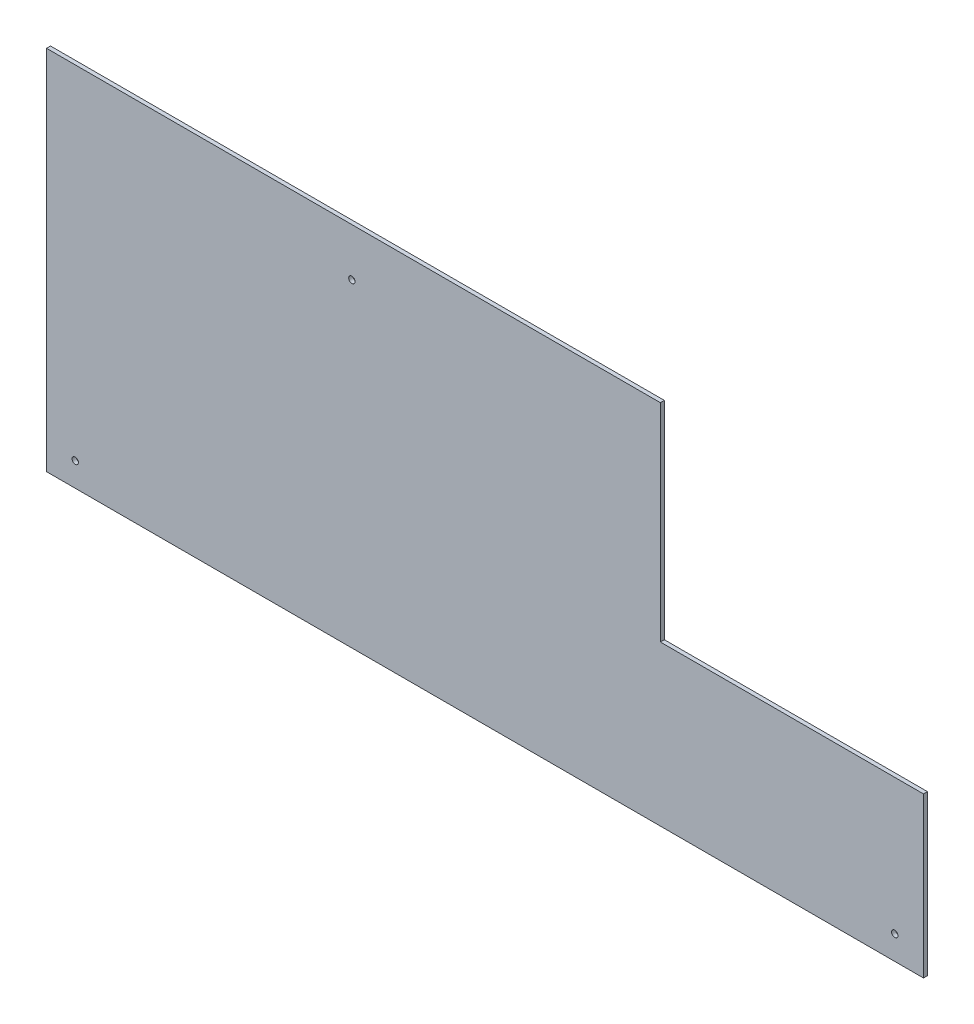
ISO-10303-21;
HEADER;
FILE_DESCRIPTION(('STEP AP214'),'2;1');
FILE_NAME('part.step','',(''),(''),'','','');
FILE_SCHEMA(('AUTOMOTIVE_DESIGN { 1 0 10303 214 1 1 1 1 }'));
ENDSEC;
DATA;
#1=APPLICATION_CONTEXT('core data for automotive mechanical design processes');
#2=APPLICATION_PROTOCOL_DEFINITION('international standard','automotive_design',2000,#1);
#3=PRODUCT_CONTEXT('',#1,'mechanical');
#4=PRODUCT('Part','Part','',(#3));
#5=PRODUCT_RELATED_PRODUCT_CATEGORY('part','',(#4));
#6=PRODUCT_DEFINITION_FORMATION('','',#4);
#7=PRODUCT_DEFINITION_CONTEXT('part definition',#1,'design');
#8=PRODUCT_DEFINITION('design','',#6,#7);
#9=PRODUCT_DEFINITION_SHAPE('','',#8);
#10=(LENGTH_UNIT() NAMED_UNIT(*) SI_UNIT(.MILLI.,.METRE.));
#11=(NAMED_UNIT(*) PLANE_ANGLE_UNIT() SI_UNIT($,.RADIAN.));
#12=(NAMED_UNIT(*) SI_UNIT($,.STERADIAN.) SOLID_ANGLE_UNIT());
#13=UNCERTAINTY_MEASURE_WITH_UNIT(LENGTH_MEASURE(1.E-05),#10,'distance_accuracy_value','');
#14=(GEOMETRIC_REPRESENTATION_CONTEXT(3) GLOBAL_UNCERTAINTY_ASSIGNED_CONTEXT((#13)) GLOBAL_UNIT_ASSIGNED_CONTEXT((#10,
#11,#12)) REPRESENTATION_CONTEXT('',''));
#15=CARTESIAN_POINT('',(0.,0.,0.));
#16=DIRECTION('',(0.,0.,1.));
#17=DIRECTION('',(1.,0.,0.));
#18=AXIS2_PLACEMENT_3D('',#15,#16,#17);
#19=CARTESIAN_POINT('',(275.,-115.,2.5));
#20=DIRECTION('',(-1.,0.,0.));
#21=DIRECTION('',(0.,0.,1.));
#22=AXIS2_PLACEMENT_3D('',#19,#20,#21);
#23=PLANE('',#22);
#24=DIRECTION('',(0.,1.,0.));
#25=VECTOR('',#24,1.);
#26=CARTESIAN_POINT('',(275.,-115.,0.));
#27=LINE('',#26,#25);
#28=CARTESIAN_POINT('',(275.,-115.,0.));
#29=VERTEX_POINT('',#28);
#30=CARTESIAN_POINT('',(275.,-15.,0.));
#31=VERTEX_POINT('',#30);
#32=EDGE_CURVE('E132',#29,#31,#27,.T.);
#33=ORIENTED_EDGE('',*,*,#32,.T.);
#34=DIRECTION('',(0.,0.,-1.));
#35=VECTOR('',#34,1.);
#36=CARTESIAN_POINT('',(275.,-15.,10.));
#37=LINE('',#36,#35);
#38=CARTESIAN_POINT('',(275.,-15.,2.5));
#39=VERTEX_POINT('',#38);
#40=EDGE_CURVE('E57',#39,#31,#37,.T.);
#41=ORIENTED_EDGE('',*,*,#40,.F.);
#42=DIRECTION('',(0.,1.,0.));
#43=VECTOR('',#42,1.);
#44=CARTESIAN_POINT('',(275.,-115.,2.5));
#45=LINE('',#44,#43);
#46=CARTESIAN_POINT('',(275.,-115.,2.5));
#47=VERTEX_POINT('',#46);
#48=EDGE_CURVE('E133',#47,#39,#45,.T.);
#49=ORIENTED_EDGE('',*,*,#48,.F.);
#50=DIRECTION('',(0.,0.,-1.));
#51=VECTOR('',#50,1.);
#52=CARTESIAN_POINT('',(275.,-115.,2.5));
#53=LINE('',#52,#51);
#54=EDGE_CURVE('E139',#47,#29,#53,.T.);
#55=ORIENTED_EDGE('',*,*,#54,.T.);
#56=EDGE_LOOP('',(#33,#41,#49,#55));
#57=FACE_BOUND('',#56,.T.);
#58=ADVANCED_FACE('F41',(#57),#23,.F.);
#59=CARTESIAN_POINT('',(275.,115.,2.5));
#60=DIRECTION('',(0.,-1.,0.));
#61=DIRECTION('',(1.,0.,0.));
#62=AXIS2_PLACEMENT_3D('',#59,#60,#61);
#63=PLANE('',#62);
#64=DIRECTION('',(-1.,0.,0.));
#65=VECTOR('',#64,1.);
#66=CARTESIAN_POINT('',(275.,115.,2.5));
#67=LINE('',#66,#65);
#68=CARTESIAN_POINT('',(110.,115.,2.5));
#69=VERTEX_POINT('',#68);
#70=CARTESIAN_POINT('',(-275.,115.,2.5));
#71=VERTEX_POINT('',#70);
#72=EDGE_CURVE('E88',#69,#71,#67,.T.);
#73=ORIENTED_EDGE('',*,*,#72,.F.);
#74=DIRECTION('',(0.,0.,-1.));
#75=VECTOR('',#74,1.);
#76=CARTESIAN_POINT('',(110.,115.,10.));
#77=LINE('',#76,#75);
#78=CARTESIAN_POINT('',(110.,115.,0.));
#79=VERTEX_POINT('',#78);
#80=EDGE_CURVE('E112',#69,#79,#77,.T.);
#81=ORIENTED_EDGE('',*,*,#80,.T.);
#82=DIRECTION('',(-1.,0.,0.));
#83=VECTOR('',#82,1.);
#84=CARTESIAN_POINT('',(275.,115.,0.));
#85=LINE('',#84,#83);
#86=CARTESIAN_POINT('',(-275.,115.,0.));
#87=VERTEX_POINT('',#86);
#88=EDGE_CURVE('E123',#79,#87,#85,.T.);
#89=ORIENTED_EDGE('',*,*,#88,.T.);
#90=DIRECTION('',(0.,0.,-1.));
#91=VECTOR('',#90,1.);
#92=CARTESIAN_POINT('',(-275.,115.,2.5));
#93=LINE('',#92,#91);
#94=EDGE_CURVE('E11',#71,#87,#93,.T.);
#95=ORIENTED_EDGE('',*,*,#94,.F.);
#96=EDGE_LOOP('',(#73,#81,#89,#95));
#97=FACE_BOUND('',#96,.T.);
#98=ADVANCED_FACE('F171',(#97),#63,.F.);
#99=CARTESIAN_POINT('',(-275.,-115.,2.5));
#100=DIRECTION('',(1.,0.,0.));
#101=DIRECTION('',(0.,0.,-1.));
#102=AXIS2_PLACEMENT_3D('',#99,#100,#101);
#103=PLANE('',#102);
#104=DIRECTION('',(0.,-1.,0.));
#105=VECTOR('',#104,1.);
#106=CARTESIAN_POINT('',(-275.,-115.,0.));
#107=LINE('',#106,#105);
#108=CARTESIAN_POINT('',(-275.,-115.,0.));
#109=VERTEX_POINT('',#108);
#110=EDGE_CURVE('E142',#87,#109,#107,.T.);
#111=ORIENTED_EDGE('',*,*,#110,.T.);
#112=DIRECTION('',(0.,0.,-1.));
#113=VECTOR('',#112,1.);
#114=CARTESIAN_POINT('',(-275.,-115.,2.5));
#115=LINE('',#114,#113);
#116=CARTESIAN_POINT('',(-275.,-115.,2.5));
#117=VERTEX_POINT('',#116);
#118=EDGE_CURVE('E49',#117,#109,#115,.T.);
#119=ORIENTED_EDGE('',*,*,#118,.F.);
#120=DIRECTION('',(0.,-1.,0.));
#121=VECTOR('',#120,1.);
#122=CARTESIAN_POINT('',(-275.,-115.,2.5));
#123=LINE('',#122,#121);
#124=EDGE_CURVE('E136',#71,#117,#123,.T.);
#125=ORIENTED_EDGE('',*,*,#124,.F.);
#126=ORIENTED_EDGE('',*,*,#94,.T.);
#127=EDGE_LOOP('',(#111,#119,#125,#126));
#128=FACE_BOUND('',#127,.T.);
#129=ADVANCED_FACE('F176',(#128),#103,.F.);
#130=CARTESIAN_POINT('',(275.,-115.,2.5));
#131=DIRECTION('',(0.,1.,0.));
#132=DIRECTION('',(-1.,0.,0.));
#133=AXIS2_PLACEMENT_3D('',#130,#131,#132);
#134=PLANE('',#133);
#135=DIRECTION('',(1.,0.,0.));
#136=VECTOR('',#135,1.);
#137=CARTESIAN_POINT('',(275.,-115.,0.));
#138=LINE('',#137,#136);
#139=EDGE_CURVE('E83',#109,#29,#138,.T.);
#140=ORIENTED_EDGE('',*,*,#139,.T.);
#141=ORIENTED_EDGE('',*,*,#54,.F.);
#142=DIRECTION('',(1.,0.,0.));
#143=VECTOR('',#142,1.);
#144=CARTESIAN_POINT('',(275.,-115.,2.5));
#145=LINE('',#144,#143);
#146=EDGE_CURVE('E66',#117,#47,#145,.T.);
#147=ORIENTED_EDGE('',*,*,#146,.F.);
#148=ORIENTED_EDGE('',*,*,#118,.T.);
#149=EDGE_LOOP('',(#140,#141,#147,#148));
#150=FACE_BOUND('',#149,.T.);
#151=ADVANCED_FACE('F182',(#150),#134,.F.);
#152=CARTESIAN_POINT('',(0.,0.,2.5));
#153=DIRECTION('',(0.,0.,1.));
#154=DIRECTION('',(1.,0.,0.));
#155=AXIS2_PLACEMENT_3D('',#152,#153,#154);
#156=PLANE('',#155);
#157=CARTESIAN_POINT('',(-83.5000000000001,84.9999999999999,2.5));
#158=DIRECTION('',(0.,0.,1.));
#159=DIRECTION('',(1.,0.,0.));
#160=AXIS2_PLACEMENT_3D('',#157,#158,#159);
#161=CIRCLE('',#160,2.);
#162=CARTESIAN_POINT('',(-81.5000000000001,84.9999999999999,2.5));
#163=VERTEX_POINT('',#162);
#164=EDGE_CURVE('E150',#163,#163,#161,.T.);
#165=ORIENTED_EDGE('',*,*,#164,.F.);
#166=EDGE_LOOP('',(#165));
#167=FACE_BOUND('',#166,.T.);
#168=CARTESIAN_POINT('',(-257.,-99.9999999999979,2.5));
#169=DIRECTION('',(0.,0.,1.));
#170=DIRECTION('',(1.,0.,0.));
#171=AXIS2_PLACEMENT_3D('',#168,#169,#170);
#172=CIRCLE('',#171,2.);
#173=CARTESIAN_POINT('',(-255.,-99.9999999999979,2.5));
#174=VERTEX_POINT('',#173);
#175=EDGE_CURVE('E295',#174,#174,#172,.T.);
#176=ORIENTED_EDGE('',*,*,#175,.F.);
#177=EDGE_LOOP('',(#176));
#178=FACE_BOUND('',#177,.T.);
#179=CARTESIAN_POINT('',(257.,-99.9999999999979,2.5));
#180=DIRECTION('',(0.,0.,1.));
#181=DIRECTION('',(1.,0.,0.));
#182=AXIS2_PLACEMENT_3D('',#179,#180,#181);
#183=CIRCLE('',#182,2.);
#184=CARTESIAN_POINT('',(259.,-99.9999999999979,2.5));
#185=VERTEX_POINT('',#184);
#186=EDGE_CURVE('E291',#185,#185,#183,.T.);
#187=ORIENTED_EDGE('',*,*,#186,.F.);
#188=EDGE_LOOP('',(#187));
#189=FACE_BOUND('',#188,.T.);
#190=DIRECTION('',(0.,-1.,0.));
#191=VECTOR('',#190,1.);
#192=CARTESIAN_POINT('',(110.,0.,2.5));
#193=LINE('',#192,#191);
#194=CARTESIAN_POINT('',(110.,-15.,2.5));
#195=VERTEX_POINT('',#194);
#196=EDGE_CURVE('E110',#69,#195,#193,.T.);
#197=ORIENTED_EDGE('',*,*,#196,.F.);
#198=ORIENTED_EDGE('',*,*,#72,.T.);
#199=ORIENTED_EDGE('',*,*,#124,.T.);
#200=ORIENTED_EDGE('',*,*,#146,.T.);
#201=ORIENTED_EDGE('',*,*,#48,.T.);
#202=DIRECTION('',(1.,0.,0.));
#203=VECTOR('',#202,1.);
#204=CARTESIAN_POINT('',(0.,-15.,2.5));
#205=LINE('',#204,#203);
#206=EDGE_CURVE('E128',#195,#39,#205,.T.);
#207=ORIENTED_EDGE('',*,*,#206,.F.);
#208=EDGE_LOOP('',(#197,#198,#199,#200,#201,#207));
#209=FACE_BOUND('',#208,.T.);
#210=ADVANCED_FACE('F183',(#167,#178,#189,#209),#156,.T.);
#211=CARTESIAN_POINT('',(0.,0.,0.));
#212=DIRECTION('',(0.,0.,1.));
#213=DIRECTION('',(1.,0.,0.));
#214=AXIS2_PLACEMENT_3D('',#211,#212,#213);
#215=PLANE('',#214);
#216=CARTESIAN_POINT('',(-83.5000000000001,84.9999999999999,0.));
#217=DIRECTION('',(0.,0.,1.));
#218=DIRECTION('',(1.,0.,0.));
#219=AXIS2_PLACEMENT_3D('',#216,#217,#218);
#220=CIRCLE('',#219,2.);
#221=CARTESIAN_POINT('',(-81.5000000000001,84.9999999999999,0.));
#222=VERTEX_POINT('',#221);
#223=EDGE_CURVE('E44',#222,#222,#220,.T.);
#224=ORIENTED_EDGE('',*,*,#223,.T.);
#225=EDGE_LOOP('',(#224));
#226=FACE_BOUND('',#225,.T.);
#227=CARTESIAN_POINT('',(-257.,-99.9999999999979,0.));
#228=DIRECTION('',(0.,0.,1.));
#229=DIRECTION('',(1.,0.,0.));
#230=AXIS2_PLACEMENT_3D('',#227,#228,#229);
#231=CIRCLE('',#230,2.);
#232=CARTESIAN_POINT('',(-255.,-99.9999999999979,0.));
#233=VERTEX_POINT('',#232);
#234=EDGE_CURVE('E149',#233,#233,#231,.T.);
#235=ORIENTED_EDGE('',*,*,#234,.T.);
#236=EDGE_LOOP('',(#235));
#237=FACE_BOUND('',#236,.T.);
#238=CARTESIAN_POINT('',(257.,-99.9999999999979,0.));
#239=DIRECTION('',(0.,0.,1.));
#240=DIRECTION('',(1.,0.,0.));
#241=AXIS2_PLACEMENT_3D('',#238,#239,#240);
#242=CIRCLE('',#241,2.);
#243=CARTESIAN_POINT('',(259.,-99.9999999999979,0.));
#244=VERTEX_POINT('',#243);
#245=EDGE_CURVE('E147',#244,#244,#242,.T.);
#246=ORIENTED_EDGE('',*,*,#245,.T.);
#247=EDGE_LOOP('',(#246));
#248=FACE_BOUND('',#247,.T.);
#249=ORIENTED_EDGE('',*,*,#88,.F.);
#250=DIRECTION('',(0.,1.,0.));
#251=VECTOR('',#250,1.);
#252=CARTESIAN_POINT('',(110.,115.,0.));
#253=LINE('',#252,#251);
#254=CARTESIAN_POINT('',(110.,-15.,0.));
#255=VERTEX_POINT('',#254);
#256=EDGE_CURVE('E108',#255,#79,#253,.T.);
#257=ORIENTED_EDGE('',*,*,#256,.F.);
#258=DIRECTION('',(-1.,0.,0.));
#259=VECTOR('',#258,1.);
#260=CARTESIAN_POINT('',(275.,-15.,0.));
#261=LINE('',#260,#259);
#262=EDGE_CURVE('E114',#31,#255,#261,.T.);
#263=ORIENTED_EDGE('',*,*,#262,.F.);
#264=ORIENTED_EDGE('',*,*,#32,.F.);
#265=ORIENTED_EDGE('',*,*,#139,.F.);
#266=ORIENTED_EDGE('',*,*,#110,.F.);
#267=EDGE_LOOP('',(#249,#257,#263,#264,#265,#266));
#268=FACE_BOUND('',#267,.T.);
#269=ADVANCED_FACE('F121',(#226,#237,#248,#268),#215,.F.);
#270=CARTESIAN_POINT('',(110.,115.,10.));
#271=DIRECTION('',(-1.,0.,0.));
#272=DIRECTION('',(0.,-1.,0.));
#273=AXIS2_PLACEMENT_3D('',#270,#271,#272);
#274=PLANE('',#273);
#275=ORIENTED_EDGE('',*,*,#196,.T.);
#276=DIRECTION('',(0.,0.,-1.));
#277=VECTOR('',#276,1.);
#278=CARTESIAN_POINT('',(110.,-15.,10.));
#279=LINE('',#278,#277);
#280=EDGE_CURVE('E105',#195,#255,#279,.T.);
#281=ORIENTED_EDGE('',*,*,#280,.T.);
#282=ORIENTED_EDGE('',*,*,#256,.T.);
#283=ORIENTED_EDGE('',*,*,#80,.F.);
#284=EDGE_LOOP('',(#275,#281,#282,#283));
#285=FACE_BOUND('',#284,.T.);
#286=ADVANCED_FACE('F106',(#285),#274,.F.);
#287=CARTESIAN_POINT('',(275.,-15.,10.));
#288=DIRECTION('',(0.,-1.,0.));
#289=DIRECTION('',(0.,0.,-1.));
#290=AXIS2_PLACEMENT_3D('',#287,#288,#289);
#291=PLANE('',#290);
#292=ORIENTED_EDGE('',*,*,#206,.T.);
#293=ORIENTED_EDGE('',*,*,#40,.T.);
#294=ORIENTED_EDGE('',*,*,#262,.T.);
#295=ORIENTED_EDGE('',*,*,#280,.F.);
#296=EDGE_LOOP('',(#292,#293,#294,#295));
#297=FACE_BOUND('',#296,.T.);
#298=ADVANCED_FACE('F115',(#297),#291,.F.);
#299=CARTESIAN_POINT('',(257.,-99.9999999999979,-7.5));
#300=DIRECTION('',(0.,0.,1.));
#301=DIRECTION('',(1.,0.,0.));
#302=AXIS2_PLACEMENT_3D('',#299,#300,#301);
#303=CYLINDRICAL_SURFACE('',#302,2.);
#304=ORIENTED_EDGE('',*,*,#186,.T.);
#305=EDGE_LOOP('',(#304));
#306=FACE_BOUND('',#305,.T.);
#307=ORIENTED_EDGE('',*,*,#245,.F.);
#308=EDGE_LOOP('',(#307));
#309=FACE_BOUND('',#308,.T.);
#310=ADVANCED_FACE('F166',(#306,#309),#303,.F.);
#311=CARTESIAN_POINT('',(-257.,-99.9999999999979,-7.5));
#312=DIRECTION('',(0.,0.,1.));
#313=DIRECTION('',(1.,0.,0.));
#314=AXIS2_PLACEMENT_3D('',#311,#312,#313);
#315=CYLINDRICAL_SURFACE('',#314,2.);
#316=ORIENTED_EDGE('',*,*,#175,.T.);
#317=EDGE_LOOP('',(#316));
#318=FACE_BOUND('',#317,.T.);
#319=ORIENTED_EDGE('',*,*,#234,.F.);
#320=EDGE_LOOP('',(#319));
#321=FACE_BOUND('',#320,.T.);
#322=ADVANCED_FACE('F160',(#318,#321),#315,.F.);
#323=CARTESIAN_POINT('',(-83.5000000000001,84.9999999999999,-7.5));
#324=DIRECTION('',(0.,0.,1.));
#325=DIRECTION('',(1.,0.,0.));
#326=AXIS2_PLACEMENT_3D('',#323,#324,#325);
#327=CYLINDRICAL_SURFACE('',#326,2.);
#328=ORIENTED_EDGE('',*,*,#164,.T.);
#329=EDGE_LOOP('',(#328));
#330=FACE_BOUND('',#329,.T.);
#331=ORIENTED_EDGE('',*,*,#223,.F.);
#332=EDGE_LOOP('',(#331));
#333=FACE_BOUND('',#332,.T.);
#334=ADVANCED_FACE('F158',(#330,#333),#327,.F.);
#335=CLOSED_SHELL('',(#58,#98,#129,#151,#210,#269,#286,#298,#310,#322,#334));
#336=MANIFOLD_SOLID_BREP('B2',#335);
#337=ADVANCED_BREP_SHAPE_REPRESENTATION('',(#18,#336),#14);
#338=SHAPE_DEFINITION_REPRESENTATION(#9,#337);
ENDSEC;
END-ISO-10303-21;
